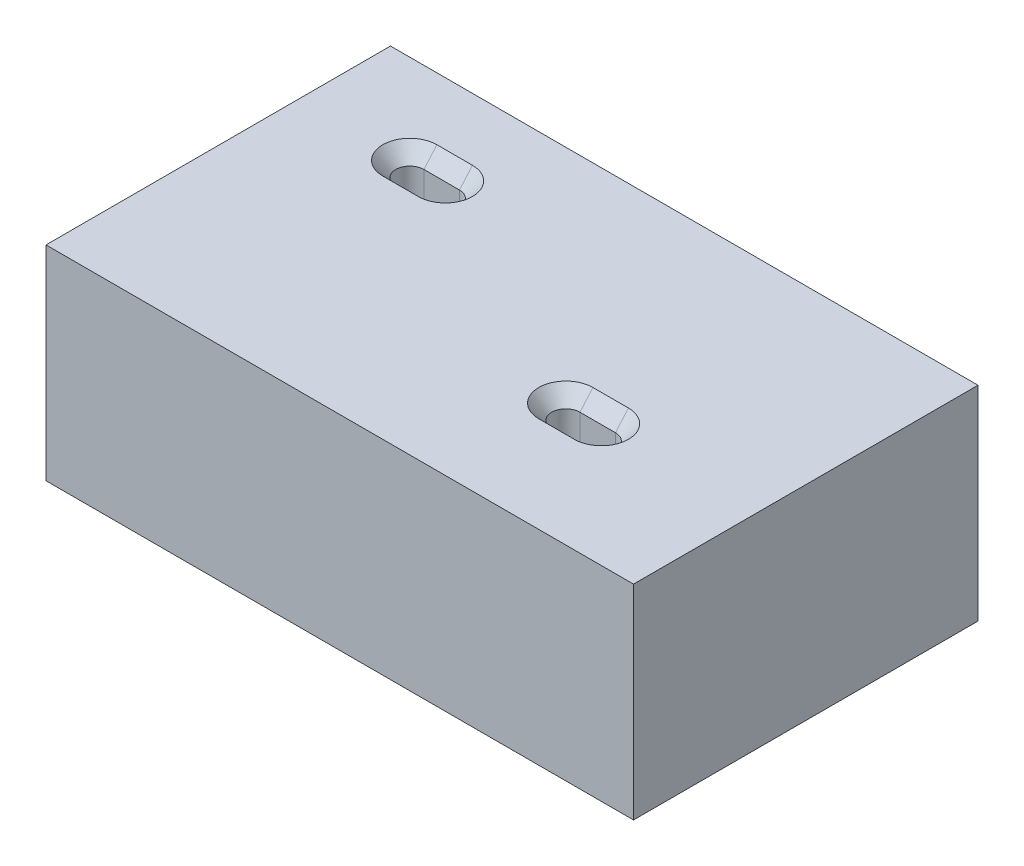
ISO-10303-21;
HEADER;
FILE_DESCRIPTION(('STEP AP214'),'2;1');
FILE_NAME('part.step','',(''),(''),'','','');
FILE_SCHEMA(('AUTOMOTIVE_DESIGN { 1 0 10303 214 1 1 1 1 }'));
ENDSEC;
DATA;
#1=APPLICATION_CONTEXT('core data for automotive mechanical design processes');
#2=APPLICATION_PROTOCOL_DEFINITION('international standard','automotive_design',2000,#1);
#3=PRODUCT_CONTEXT('',#1,'mechanical');
#4=PRODUCT('Part','Part','',(#3));
#5=PRODUCT_RELATED_PRODUCT_CATEGORY('part','',(#4));
#6=PRODUCT_DEFINITION_FORMATION('','',#4);
#7=PRODUCT_DEFINITION_CONTEXT('part definition',#1,'design');
#8=PRODUCT_DEFINITION('design','',#6,#7);
#9=PRODUCT_DEFINITION_SHAPE('','',#8);
#10=(LENGTH_UNIT() NAMED_UNIT(*) SI_UNIT(.MILLI.,.METRE.));
#11=(NAMED_UNIT(*) PLANE_ANGLE_UNIT() SI_UNIT($,.RADIAN.));
#12=(NAMED_UNIT(*) SI_UNIT($,.STERADIAN.) SOLID_ANGLE_UNIT());
#13=UNCERTAINTY_MEASURE_WITH_UNIT(LENGTH_MEASURE(1.E-05),#10,'distance_accuracy_value','');
#14=(GEOMETRIC_REPRESENTATION_CONTEXT(3) GLOBAL_UNCERTAINTY_ASSIGNED_CONTEXT((#13)) GLOBAL_UNIT_ASSIGNED_CONTEXT((#10,
#11,#12)) REPRESENTATION_CONTEXT('',''));
#15=CARTESIAN_POINT('',(0.,0.,0.));
#16=DIRECTION('',(0.,0.,1.));
#17=DIRECTION('',(1.,0.,0.));
#18=AXIS2_PLACEMENT_3D('',#15,#16,#17);
#19=CARTESIAN_POINT('',(0.,73.,0.));
#20=DIRECTION('',(0.,-1.,0.));
#21=DIRECTION('',(0.,0.,-1.));
#22=AXIS2_PLACEMENT_3D('',#19,#20,#21);
#23=PLANE('',#22);
#24=DIRECTION('',(1.,0.,0.));
#25=VECTOR('',#24,1.);
#26=CARTESIAN_POINT('',(36.8752456812785,73.,27.3159133510504));
#27=LINE('',#26,#25);
#28=CARTESIAN_POINT('',(36.8752456812785,73.,27.3159133510504));
#29=VERTEX_POINT('',#28);
#30=CARTESIAN_POINT('',(49.5752456812785,73.,27.3159133510504));
#31=VERTEX_POINT('',#30);
#32=EDGE_CURVE('E339',#29,#31,#27,.T.);
#33=ORIENTED_EDGE('',*,*,#32,.F.);
#34=CARTESIAN_POINT('',(36.8752456812785,73.,17.6385133510504));
#35=DIRECTION('',(0.,1.,0.));
#36=DIRECTION('',(0.,0.,1.));
#37=AXIS2_PLACEMENT_3D('',#34,#35,#36);
#38=CIRCLE('',#37,9.6774);
#39=CARTESIAN_POINT('',(36.8752456812785,73.,7.96111335105041));
#40=VERTEX_POINT('',#39);
#41=EDGE_CURVE('E356',#40,#29,#38,.T.);
#42=ORIENTED_EDGE('',*,*,#41,.F.);
#43=DIRECTION('',(1.,0.,0.));
#44=VECTOR('',#43,1.);
#45=CARTESIAN_POINT('',(36.8752456812785,73.,7.96111335105041));
#46=LINE('',#45,#44);
#47=CARTESIAN_POINT('',(49.5752456812785,73.,7.96111335105041));
#48=VERTEX_POINT('',#47);
#49=EDGE_CURVE('E348',#40,#48,#46,.T.);
#50=ORIENTED_EDGE('',*,*,#49,.T.);
#51=CARTESIAN_POINT('',(49.5752456812785,73.,17.6385133510504));
#52=DIRECTION('',(0.,1.,0.));
#53=DIRECTION('',(0.,0.,1.));
#54=AXIS2_PLACEMENT_3D('',#51,#52,#53);
#55=CIRCLE('',#54,9.6774);
#56=EDGE_CURVE('E372',#31,#48,#55,.T.);
#57=ORIENTED_EDGE('',*,*,#56,.F.);
#58=EDGE_LOOP('',(#33,#42,#50,#57));
#59=FACE_BOUND('',#58,.T.);
#60=DIRECTION('',(-1.,0.,0.));
#61=VECTOR('',#60,1.);
#62=CARTESIAN_POINT('',(104.976207719473,73.,-61.5512671348957));
#63=LINE('',#62,#61);
#64=CARTESIAN_POINT('',(104.976207719473,73.,-61.5512671348957));
#65=VERTEX_POINT('',#64);
#66=CARTESIAN_POINT('',(-104.976207719473,73.,-61.5512671348957));
#67=VERTEX_POINT('',#66);
#68=EDGE_CURVE('E384',#65,#67,#63,.T.);
#69=ORIENTED_EDGE('',*,*,#68,.T.);
#70=DIRECTION('',(0.,0.,-1.));
#71=VECTOR('',#70,1.);
#72=CARTESIAN_POINT('',(-104.976207719473,73.,61.5512671348957));
#73=LINE('',#72,#71);
#74=CARTESIAN_POINT('',(-104.976207719473,73.,61.5512671348957));
#75=VERTEX_POINT('',#74);
#76=EDGE_CURVE('E386',#75,#67,#73,.T.);
#77=ORIENTED_EDGE('',*,*,#76,.F.);
#78=DIRECTION('',(-1.,0.,0.));
#79=VECTOR('',#78,1.);
#80=CARTESIAN_POINT('',(104.976207719473,73.,61.5512671348957));
#81=LINE('',#80,#79);
#82=CARTESIAN_POINT('',(104.976207719473,73.,61.5512671348957));
#83=VERTEX_POINT('',#82);
#84=EDGE_CURVE('E390',#83,#75,#81,.T.);
#85=ORIENTED_EDGE('',*,*,#84,.F.);
#86=DIRECTION('',(0.,0.,-1.));
#87=VECTOR('',#86,1.);
#88=CARTESIAN_POINT('',(104.976207719473,73.,61.5512671348957));
#89=LINE('',#88,#87);
#90=EDGE_CURVE('E393',#83,#65,#89,.T.);
#91=ORIENTED_EDGE('',*,*,#90,.T.);
#92=EDGE_LOOP('',(#69,#77,#85,#91));
#93=FACE_BOUND('',#92,.T.);
#94=DIRECTION('',(1.,0.,0.));
#95=VECTOR('',#94,1.);
#96=CARTESIAN_POINT('',(-66.1249619118939,73.,-19.9378816758384));
#97=LINE('',#96,#95);
#98=CARTESIAN_POINT('',(-66.1249619118939,73.,-19.9378816758384));
#99=VERTEX_POINT('',#98);
#100=CARTESIAN_POINT('',(-53.4249619118939,73.,-19.9378816758384));
#101=VERTEX_POINT('',#100);
#102=EDGE_CURVE('E467',#99,#101,#97,.T.);
#103=ORIENTED_EDGE('',*,*,#102,.F.);
#104=CARTESIAN_POINT('',(-66.1249619118939,73.,-29.6152816758384));
#105=DIRECTION('',(0.,1.,0.));
#106=DIRECTION('',(0.,0.,1.));
#107=AXIS2_PLACEMENT_3D('',#104,#105,#106);
#108=CIRCLE('',#107,9.6774);
#109=CARTESIAN_POINT('',(-66.1249619118939,73.,-39.2926816758384));
#110=VERTEX_POINT('',#109);
#111=EDGE_CURVE('E311',#110,#99,#108,.T.);
#112=ORIENTED_EDGE('',*,*,#111,.F.);
#113=DIRECTION('',(1.,0.,0.));
#114=VECTOR('',#113,1.);
#115=CARTESIAN_POINT('',(-66.1249619118939,73.,-39.2926816758384));
#116=LINE('',#115,#114);
#117=CARTESIAN_POINT('',(-53.424961911894,73.,-39.2926816758384));
#118=VERTEX_POINT('',#117);
#119=EDGE_CURVE('E304',#110,#118,#116,.T.);
#120=ORIENTED_EDGE('',*,*,#119,.T.);
#121=CARTESIAN_POINT('',(-53.4249619118939,73.,-29.6152816758384));
#122=DIRECTION('',(0.,1.,0.));
#123=DIRECTION('',(0.,0.,1.));
#124=AXIS2_PLACEMENT_3D('',#121,#122,#123);
#125=CIRCLE('',#124,9.6774);
#126=EDGE_CURVE('E328',#101,#118,#125,.T.);
#127=ORIENTED_EDGE('',*,*,#126,.F.);
#128=EDGE_LOOP('',(#103,#112,#120,#127));
#129=FACE_BOUND('',#128,.T.);
#130=ADVANCED_FACE('F181',(#59,#93,#129),#23,.F.);
#131=CARTESIAN_POINT('',(104.976207719473,73.,-61.5512671348957));
#132=DIRECTION('',(0.,0.,1.));
#133=DIRECTION('',(1.,0.,0.));
#134=AXIS2_PLACEMENT_3D('',#131,#132,#133);
#135=PLANE('',#134);
#136=DIRECTION('',(-1.,0.,0.));
#137=VECTOR('',#136,1.);
#138=CARTESIAN_POINT('',(104.976207719473,0.,-61.5512671348957));
#139=LINE('',#138,#137);
#140=CARTESIAN_POINT('',(104.976207719473,0.,-61.5512671348957));
#141=VERTEX_POINT('',#140);
#142=CARTESIAN_POINT('',(-104.976207719473,0.,-61.5512671348957));
#143=VERTEX_POINT('',#142);
#144=EDGE_CURVE('E383',#141,#143,#139,.T.);
#145=ORIENTED_EDGE('',*,*,#144,.T.);
#146=DIRECTION('',(0.,-1.,0.));
#147=VECTOR('',#146,1.);
#148=CARTESIAN_POINT('',(-104.976207719473,73.,-61.5512671348957));
#149=LINE('',#148,#147);
#150=EDGE_CURVE('E411',#67,#143,#149,.T.);
#151=ORIENTED_EDGE('',*,*,#150,.F.);
#152=ORIENTED_EDGE('',*,*,#68,.F.);
#153=DIRECTION('',(0.,-1.,0.));
#154=VECTOR('',#153,1.);
#155=CARTESIAN_POINT('',(104.976207719473,73.,-61.5512671348957));
#156=LINE('',#155,#154);
#157=EDGE_CURVE('E395',#65,#141,#156,.T.);
#158=ORIENTED_EDGE('',*,*,#157,.T.);
#159=EDGE_LOOP('',(#145,#151,#152,#158));
#160=FACE_BOUND('',#159,.T.);
#161=ADVANCED_FACE('F183',(#160),#135,.F.);
#162=CARTESIAN_POINT('',(-104.976207719473,73.,61.5512671348957));
#163=DIRECTION('',(-1.,0.,0.));
#164=DIRECTION('',(0.,0.,1.));
#165=AXIS2_PLACEMENT_3D('',#162,#163,#164);
#166=PLANE('',#165);
#167=DIRECTION('',(0.,0.,-1.));
#168=VECTOR('',#167,1.);
#169=CARTESIAN_POINT('',(-104.976207719473,0.,61.5512671348957));
#170=LINE('',#169,#168);
#171=CARTESIAN_POINT('',(-104.976207719473,0.,61.5512671348957));
#172=VERTEX_POINT('',#171);
#173=EDGE_CURVE('E398',#172,#143,#170,.T.);
#174=ORIENTED_EDGE('',*,*,#173,.F.);
#175=DIRECTION('',(0.,-1.,0.));
#176=VECTOR('',#175,1.);
#177=CARTESIAN_POINT('',(-104.976207719473,73.,61.5512671348957));
#178=LINE('',#177,#176);
#179=EDGE_CURVE('E409',#75,#172,#178,.T.);
#180=ORIENTED_EDGE('',*,*,#179,.F.);
#181=ORIENTED_EDGE('',*,*,#76,.T.);
#182=ORIENTED_EDGE('',*,*,#150,.T.);
#183=EDGE_LOOP('',(#174,#180,#181,#182));
#184=FACE_BOUND('',#183,.T.);
#185=ADVANCED_FACE('F459',(#184),#166,.T.);
#186=CARTESIAN_POINT('',(104.976207719473,73.,61.5512671348957));
#187=DIRECTION('',(0.,0.,1.));
#188=DIRECTION('',(1.,0.,0.));
#189=AXIS2_PLACEMENT_3D('',#186,#187,#188);
#190=PLANE('',#189);
#191=DIRECTION('',(-1.,0.,0.));
#192=VECTOR('',#191,1.);
#193=CARTESIAN_POINT('',(104.976207719473,0.,61.5512671348957));
#194=LINE('',#193,#192);
#195=CARTESIAN_POINT('',(104.976207719473,0.,61.5512671348957));
#196=VERTEX_POINT('',#195);
#197=EDGE_CURVE('E401',#196,#172,#194,.T.);
#198=ORIENTED_EDGE('',*,*,#197,.F.);
#199=DIRECTION('',(0.,-1.,0.));
#200=VECTOR('',#199,1.);
#201=CARTESIAN_POINT('',(104.976207719473,73.,61.5512671348957));
#202=LINE('',#201,#200);
#203=EDGE_CURVE('E407',#83,#196,#202,.T.);
#204=ORIENTED_EDGE('',*,*,#203,.F.);
#205=ORIENTED_EDGE('',*,*,#84,.T.);
#206=ORIENTED_EDGE('',*,*,#179,.T.);
#207=EDGE_LOOP('',(#198,#204,#205,#206));
#208=FACE_BOUND('',#207,.T.);
#209=ADVANCED_FACE('F456',(#208),#190,.T.);
#210=CARTESIAN_POINT('',(104.976207719473,73.,61.5512671348957));
#211=DIRECTION('',(-1.,0.,0.));
#212=DIRECTION('',(0.,0.,1.));
#213=AXIS2_PLACEMENT_3D('',#210,#211,#212);
#214=PLANE('',#213);
#215=DIRECTION('',(0.,0.,-1.));
#216=VECTOR('',#215,1.);
#217=CARTESIAN_POINT('',(104.976207719473,0.,61.5512671348957));
#218=LINE('',#217,#216);
#219=EDGE_CURVE('E387',#196,#141,#218,.T.);
#220=ORIENTED_EDGE('',*,*,#219,.T.);
#221=ORIENTED_EDGE('',*,*,#157,.F.);
#222=ORIENTED_EDGE('',*,*,#90,.F.);
#223=ORIENTED_EDGE('',*,*,#203,.T.);
#224=EDGE_LOOP('',(#220,#221,#222,#223));
#225=FACE_BOUND('',#224,.T.);
#226=ADVANCED_FACE('F438',(#225),#214,.F.);
#227=CARTESIAN_POINT('',(0.,0.,0.));
#228=DIRECTION('',(0.,-1.,0.));
#229=DIRECTION('',(0.,0.,-1.));
#230=AXIS2_PLACEMENT_3D('',#227,#228,#229);
#231=PLANE('',#230);
#232=DIRECTION('',(1.,0.,0.));
#233=VECTOR('',#232,1.);
#234=CARTESIAN_POINT('',(0.,0.,-34.6571816758384));
#235=LINE('',#234,#233);
#236=CARTESIAN_POINT('',(-66.1249619118939,0.,-34.6571816758384));
#237=VERTEX_POINT('',#236);
#238=CARTESIAN_POINT('',(-53.4249619118939,0.,-34.6571816758384));
#239=VERTEX_POINT('',#238);
#240=EDGE_CURVE('E13',#237,#239,#235,.T.);
#241=ORIENTED_EDGE('',*,*,#240,.F.);
#242=CARTESIAN_POINT('',(-66.1249619118939,0.,-29.6152816758384));
#243=DIRECTION('',(0.,-1.,0.));
#244=DIRECTION('',(0.,0.,-1.));
#245=AXIS2_PLACEMENT_3D('',#242,#243,#244);
#246=CIRCLE('',#245,5.04189999999999);
#247=CARTESIAN_POINT('',(-66.1249619118939,0.,-24.5733816758384));
#248=VERTEX_POINT('',#247);
#249=EDGE_CURVE('E310',#248,#237,#246,.T.);
#250=ORIENTED_EDGE('',*,*,#249,.F.);
#251=DIRECTION('',(-1.,0.,0.));
#252=VECTOR('',#251,1.);
#253=CARTESIAN_POINT('',(0.,0.,-24.5733816758385));
#254=LINE('',#253,#252);
#255=CARTESIAN_POINT('',(-53.4249619118939,0.,-24.5733816758384));
#256=VERTEX_POINT('',#255);
#257=EDGE_CURVE('E422',#256,#248,#254,.T.);
#258=ORIENTED_EDGE('',*,*,#257,.F.);
#259=CARTESIAN_POINT('',(-53.4249619118939,0.,-29.6152816758384));
#260=DIRECTION('',(0.,-1.,0.));
#261=DIRECTION('',(0.,0.,-1.));
#262=AXIS2_PLACEMENT_3D('',#259,#260,#261);
#263=CIRCLE('',#262,5.04189999999999);
#264=EDGE_CURVE('E189',#239,#256,#263,.T.);
#265=ORIENTED_EDGE('',*,*,#264,.F.);
#266=EDGE_LOOP('',(#241,#250,#258,#265));
#267=FACE_BOUND('',#266,.T.);
#268=DIRECTION('',(1.,0.,0.));
#269=VECTOR('',#268,1.);
#270=CARTESIAN_POINT('',(0.,0.,12.5966133510504));
#271=LINE('',#270,#269);
#272=CARTESIAN_POINT('',(36.8752456812785,0.,12.5966133510504));
#273=VERTEX_POINT('',#272);
#274=CARTESIAN_POINT('',(49.5752456812785,0.,12.5966133510504));
#275=VERTEX_POINT('',#274);
#276=EDGE_CURVE('E419',#273,#275,#271,.T.);
#277=ORIENTED_EDGE('',*,*,#276,.F.);
#278=CARTESIAN_POINT('',(36.8752456812785,0.,17.6385133510504));
#279=DIRECTION('',(0.,-1.,0.));
#280=DIRECTION('',(0.,0.,-1.));
#281=AXIS2_PLACEMENT_3D('',#278,#279,#280);
#282=CIRCLE('',#281,5.04189999999999);
#283=CARTESIAN_POINT('',(36.8752456812785,0.,22.6804133510504));
#284=VERTEX_POINT('',#283);
#285=EDGE_CURVE('E415',#284,#273,#282,.T.);
#286=ORIENTED_EDGE('',*,*,#285,.F.);
#287=DIRECTION('',(-1.,0.,0.));
#288=VECTOR('',#287,1.);
#289=CARTESIAN_POINT('',(0.,0.,22.6804133510504));
#290=LINE('',#289,#288);
#291=CARTESIAN_POINT('',(49.5752456812785,0.,22.6804133510504));
#292=VERTEX_POINT('',#291);
#293=EDGE_CURVE('E413',#292,#284,#290,.T.);
#294=ORIENTED_EDGE('',*,*,#293,.F.);
#295=CARTESIAN_POINT('',(49.5752456812785,0.,17.6385133510504));
#296=DIRECTION('',(0.,-1.,0.));
#297=DIRECTION('',(0.,0.,-1.));
#298=AXIS2_PLACEMENT_3D('',#295,#296,#297);
#299=CIRCLE('',#298,5.04189999999999);
#300=EDGE_CURVE('E417',#275,#292,#299,.T.);
#301=ORIENTED_EDGE('',*,*,#300,.F.);
#302=EDGE_LOOP('',(#277,#286,#294,#301));
#303=FACE_BOUND('',#302,.T.);
#304=ORIENTED_EDGE('',*,*,#144,.F.);
#305=ORIENTED_EDGE('',*,*,#219,.F.);
#306=ORIENTED_EDGE('',*,*,#197,.T.);
#307=ORIENTED_EDGE('',*,*,#173,.T.);
#308=EDGE_LOOP('',(#304,#305,#306,#307));
#309=FACE_BOUND('',#308,.T.);
#310=ADVANCED_FACE('F434',(#267,#303,#309),#231,.T.);
#311=CARTESIAN_POINT('',(49.5752456812785,73.,17.6385133510504));
#312=DIRECTION('',(0.,1.,0.));
#313=DIRECTION('',(0.,0.,1.));
#314=AXIS2_PLACEMENT_3D('',#311,#312,#313);
#315=CYLINDRICAL_SURFACE('',#314,5.04189999999999);
#316=ORIENTED_EDGE('',*,*,#300,.T.);
#317=DIRECTION('',(0.,1.,0.));
#318=VECTOR('',#317,1.);
#319=CARTESIAN_POINT('',(49.5752456812785,73.,22.6804133510504));
#320=LINE('',#319,#318);
#321=CARTESIAN_POINT('',(49.5752456812785,67.667467248327,22.6804133510504));
#322=VERTEX_POINT('',#321);
#323=EDGE_CURVE('E369',#322,#292,#320,.F.);
#324=ORIENTED_EDGE('',*,*,#323,.F.);
#325=CARTESIAN_POINT('',(49.5752456812785,67.667467248327,17.6385133510504));
#326=DIRECTION('',(0.,1.,0.));
#327=DIRECTION('',(0.,0.,1.));
#328=AXIS2_PLACEMENT_3D('',#325,#326,#327);
#329=CIRCLE('',#328,5.04189999999999);
#330=CARTESIAN_POINT('',(49.5752456812785,67.667467248327,12.5966133510504));
#331=VERTEX_POINT('',#330);
#332=EDGE_CURVE('E375',#322,#331,#329,.T.);
#333=ORIENTED_EDGE('',*,*,#332,.T.);
#334=DIRECTION('',(0.,1.,0.));
#335=VECTOR('',#334,1.);
#336=CARTESIAN_POINT('',(49.5752456812785,73.,12.5966133510504));
#337=LINE('',#336,#335);
#338=EDGE_CURVE('E367',#275,#331,#337,.T.);
#339=ORIENTED_EDGE('',*,*,#338,.F.);
#340=EDGE_LOOP('',(#316,#324,#333,#339));
#341=FACE_BOUND('',#340,.T.);
#342=ADVANCED_FACE('F437',(#341),#315,.F.);
#343=CARTESIAN_POINT('',(36.8752456812785,73.,17.6385133510504));
#344=DIRECTION('',(0.,1.,0.));
#345=DIRECTION('',(0.,0.,1.));
#346=AXIS2_PLACEMENT_3D('',#343,#344,#345);
#347=CYLINDRICAL_SURFACE('',#346,5.04189999999999);
#348=ORIENTED_EDGE('',*,*,#285,.T.);
#349=DIRECTION('',(0.,1.,0.));
#350=VECTOR('',#349,1.);
#351=CARTESIAN_POINT('',(36.8752456812785,73.,12.5966133510504));
#352=LINE('',#351,#350);
#353=CARTESIAN_POINT('',(36.8752456812785,67.667467248327,12.5966133510504));
#354=VERTEX_POINT('',#353);
#355=EDGE_CURVE('E353',#354,#273,#352,.F.);
#356=ORIENTED_EDGE('',*,*,#355,.F.);
#357=CARTESIAN_POINT('',(36.8752456812785,67.667467248327,17.6385133510504));
#358=DIRECTION('',(0.,1.,0.));
#359=DIRECTION('',(0.,0.,1.));
#360=AXIS2_PLACEMENT_3D('',#357,#358,#359);
#361=CIRCLE('',#360,5.04189999999999);
#362=CARTESIAN_POINT('',(36.8752456812785,67.667467248327,22.6804133510504));
#363=VERTEX_POINT('',#362);
#364=EDGE_CURVE('E359',#354,#363,#361,.T.);
#365=ORIENTED_EDGE('',*,*,#364,.T.);
#366=DIRECTION('',(0.,1.,0.));
#367=VECTOR('',#366,1.);
#368=CARTESIAN_POINT('',(36.8752456812785,73.,22.6804133510504));
#369=LINE('',#368,#367);
#370=EDGE_CURVE('E351',#284,#363,#369,.T.);
#371=ORIENTED_EDGE('',*,*,#370,.F.);
#372=EDGE_LOOP('',(#348,#356,#365,#371));
#373=FACE_BOUND('',#372,.T.);
#374=ADVANCED_FACE('F502',(#373),#347,.F.);
#375=CARTESIAN_POINT('',(36.8752456812785,73.,12.5966133510504));
#376=DIRECTION('',(0.,0.,-1.));
#377=DIRECTION('',(-1.,0.,0.));
#378=AXIS2_PLACEMENT_3D('',#375,#376,#377);
#379=PLANE('',#378);
#380=ORIENTED_EDGE('',*,*,#276,.T.);
#381=ORIENTED_EDGE('',*,*,#338,.T.);
#382=DIRECTION('',(1.,0.,0.));
#383=VECTOR('',#382,1.);
#384=CARTESIAN_POINT('',(36.8752456812785,67.667467248327,12.5966133510504));
#385=LINE('',#384,#383);
#386=EDGE_CURVE('E345',#354,#331,#385,.T.);
#387=ORIENTED_EDGE('',*,*,#386,.F.);
#388=ORIENTED_EDGE('',*,*,#355,.T.);
#389=EDGE_LOOP('',(#380,#381,#387,#388));
#390=FACE_BOUND('',#389,.T.);
#391=ADVANCED_FACE('F498',(#390),#379,.F.);
#392=CARTESIAN_POINT('',(36.8752456812785,73.,22.6804133510504));
#393=DIRECTION('',(0.,0.,1.));
#394=DIRECTION('',(1.,0.,0.));
#395=AXIS2_PLACEMENT_3D('',#392,#393,#394);
#396=PLANE('',#395);
#397=ORIENTED_EDGE('',*,*,#293,.T.);
#398=ORIENTED_EDGE('',*,*,#370,.T.);
#399=DIRECTION('',(1.,0.,0.));
#400=VECTOR('',#399,1.);
#401=CARTESIAN_POINT('',(36.8752456812785,67.667467248327,22.6804133510504));
#402=LINE('',#401,#400);
#403=EDGE_CURVE('E342',#363,#322,#402,.T.);
#404=ORIENTED_EDGE('',*,*,#403,.T.);
#405=ORIENTED_EDGE('',*,*,#323,.T.);
#406=EDGE_LOOP('',(#397,#398,#404,#405));
#407=FACE_BOUND('',#406,.T.);
#408=ADVANCED_FACE('F494',(#407),#396,.F.);
#409=CARTESIAN_POINT('',(49.5752456812785,73.,17.6385133510504));
#410=DIRECTION('',(0.,1.,0.));
#411=DIRECTION('',(0.,0.,1.));
#412=AXIS2_PLACEMENT_3D('',#409,#410,#411);
#413=CONICAL_SURFACE('',#412,9.6774,0.715584993317676);
#414=ORIENTED_EDGE('',*,*,#332,.F.);
#415=DIRECTION('',(0.,0.754709580222771,0.656059028990508));
#416=VECTOR('',#415,1.);
#417=CARTESIAN_POINT('',(49.5752456812785,61.8674247759594,17.6385133510504));
#418=LINE('',#417,#416);
#419=EDGE_CURVE('E380',#31,#322,#418,.F.);
#420=ORIENTED_EDGE('',*,*,#419,.F.);
#421=ORIENTED_EDGE('',*,*,#56,.T.);
#422=DIRECTION('',(0.,-0.754709580222771,0.656059028990508));
#423=VECTOR('',#422,1.);
#424=CARTESIAN_POINT('',(49.5752456812785,61.8674247759594,17.6385133510504));
#425=LINE('',#424,#423);
#426=EDGE_CURVE('E378',#331,#48,#425,.F.);
#427=ORIENTED_EDGE('',*,*,#426,.F.);
#428=EDGE_LOOP('',(#414,#420,#421,#427));
#429=FACE_BOUND('',#428,.T.);
#430=ADVANCED_FACE('F497',(#429),#413,.F.);
#431=CARTESIAN_POINT('',(36.8752456812785,73.,17.6385133510504));
#432=DIRECTION('',(0.,1.,0.));
#433=DIRECTION('',(0.,0.,1.));
#434=AXIS2_PLACEMENT_3D('',#431,#432,#433);
#435=CONICAL_SURFACE('',#434,9.6774,0.715584993317676);
#436=ORIENTED_EDGE('',*,*,#41,.T.);
#437=DIRECTION('',(0.,-0.754709580222771,-0.656059028990508));
#438=VECTOR('',#437,1.);
#439=CARTESIAN_POINT('',(36.8752456812785,61.8674247759594,17.6385133510504));
#440=LINE('',#439,#438);
#441=EDGE_CURVE('E362',#363,#29,#440,.F.);
#442=ORIENTED_EDGE('',*,*,#441,.F.);
#443=ORIENTED_EDGE('',*,*,#364,.F.);
#444=DIRECTION('',(0.,0.754709580222771,-0.656059028990508));
#445=VECTOR('',#444,1.);
#446=CARTESIAN_POINT('',(36.8752456812785,61.8674247759594,17.6385133510504));
#447=LINE('',#446,#445);
#448=EDGE_CURVE('E364',#40,#354,#447,.F.);
#449=ORIENTED_EDGE('',*,*,#448,.F.);
#450=EDGE_LOOP('',(#436,#442,#443,#449));
#451=FACE_BOUND('',#450,.T.);
#452=ADVANCED_FACE('F506',(#451),#435,.F.);
#453=CARTESIAN_POINT('',(36.8752456812785,61.8674247759594,17.6385133510504));
#454=DIRECTION('',(0.,-0.656059028990508,-0.754709580222771));
#455=DIRECTION('',(0.,0.754709580222771,-0.656059028990508));
#456=AXIS2_PLACEMENT_3D('',#453,#454,#455);
#457=PLANE('',#456);
#458=ORIENTED_EDGE('',*,*,#426,.T.);
#459=ORIENTED_EDGE('',*,*,#49,.F.);
#460=ORIENTED_EDGE('',*,*,#448,.T.);
#461=ORIENTED_EDGE('',*,*,#386,.T.);
#462=EDGE_LOOP('',(#458,#459,#460,#461));
#463=FACE_BOUND('',#462,.T.);
#464=ADVANCED_FACE('F492',(#463),#457,.F.);
#465=CARTESIAN_POINT('',(36.8752456812785,61.8674247759594,17.6385133510504));
#466=DIRECTION('',(0.,-0.656059028990508,0.754709580222771));
#467=DIRECTION('',(0.,-0.754709580222771,-0.656059028990508));
#468=AXIS2_PLACEMENT_3D('',#465,#466,#467);
#469=PLANE('',#468);
#470=ORIENTED_EDGE('',*,*,#419,.T.);
#471=ORIENTED_EDGE('',*,*,#403,.F.);
#472=ORIENTED_EDGE('',*,*,#441,.T.);
#473=ORIENTED_EDGE('',*,*,#32,.T.);
#474=EDGE_LOOP('',(#470,#471,#472,#473));
#475=FACE_BOUND('',#474,.T.);
#476=ADVANCED_FACE('F489',(#475),#469,.F.);
#477=CARTESIAN_POINT('',(-53.4249619118939,73.,-29.6152816758384));
#478=DIRECTION('',(0.,1.,0.));
#479=DIRECTION('',(0.,0.,1.));
#480=AXIS2_PLACEMENT_3D('',#477,#478,#479);
#481=CYLINDRICAL_SURFACE('',#480,5.04189999999999);
#482=ORIENTED_EDGE('',*,*,#264,.T.);
#483=DIRECTION('',(0.,1.,0.));
#484=VECTOR('',#483,1.);
#485=CARTESIAN_POINT('',(-53.4249619118939,73.,-24.5733816758384));
#486=LINE('',#485,#484);
#487=CARTESIAN_POINT('',(-53.4249619118939,67.667467248327,-24.5733816758384));
#488=VERTEX_POINT('',#487);
#489=EDGE_CURVE('E325',#488,#256,#486,.F.);
#490=ORIENTED_EDGE('',*,*,#489,.F.);
#491=CARTESIAN_POINT('',(-53.4249619118939,67.667467248327,-29.6152816758384));
#492=DIRECTION('',(0.,1.,0.));
#493=DIRECTION('',(0.,0.,1.));
#494=AXIS2_PLACEMENT_3D('',#491,#492,#493);
#495=CIRCLE('',#494,5.04189999999999);
#496=CARTESIAN_POINT('',(-53.4249619118939,67.667467248327,-34.6571816758384));
#497=VERTEX_POINT('',#496);
#498=EDGE_CURVE('E331',#488,#497,#495,.T.);
#499=ORIENTED_EDGE('',*,*,#498,.T.);
#500=DIRECTION('',(0.,1.,0.));
#501=VECTOR('',#500,1.);
#502=CARTESIAN_POINT('',(-53.4249619118939,73.,-34.6571816758384));
#503=LINE('',#502,#501);
#504=EDGE_CURVE('E301',#239,#497,#503,.T.);
#505=ORIENTED_EDGE('',*,*,#504,.F.);
#506=EDGE_LOOP('',(#482,#490,#499,#505));
#507=FACE_BOUND('',#506,.T.);
#508=ADVANCED_FACE('F427',(#507),#481,.F.);
#509=CARTESIAN_POINT('',(-66.1249619118939,73.,-29.6152816758384));
#510=DIRECTION('',(0.,1.,0.));
#511=DIRECTION('',(0.,0.,1.));
#512=AXIS2_PLACEMENT_3D('',#509,#510,#511);
#513=CYLINDRICAL_SURFACE('',#512,5.04189999999999);
#514=ORIENTED_EDGE('',*,*,#249,.T.);
#515=DIRECTION('',(0.,1.,0.));
#516=VECTOR('',#515,1.);
#517=CARTESIAN_POINT('',(-66.1249619118939,73.,-34.6571816758384));
#518=LINE('',#517,#516);
#519=CARTESIAN_POINT('',(-66.1249619118939,67.667467248327,-34.6571816758384));
#520=VERTEX_POINT('',#519);
#521=EDGE_CURVE('E298',#520,#237,#518,.F.);
#522=ORIENTED_EDGE('',*,*,#521,.F.);
#523=CARTESIAN_POINT('',(-66.1249619118939,67.667467248327,-29.6152816758384));
#524=DIRECTION('',(0.,1.,0.));
#525=DIRECTION('',(0.,0.,1.));
#526=AXIS2_PLACEMENT_3D('',#523,#524,#525);
#527=CIRCLE('',#526,5.04189999999999);
#528=CARTESIAN_POINT('',(-66.1249619118939,67.667467248327,-24.5733816758384));
#529=VERTEX_POINT('',#528);
#530=EDGE_CURVE('E308',#520,#529,#527,.T.);
#531=ORIENTED_EDGE('',*,*,#530,.T.);
#532=DIRECTION('',(0.,1.,0.));
#533=VECTOR('',#532,1.);
#534=CARTESIAN_POINT('',(-66.1249619118939,73.,-24.5733816758384));
#535=LINE('',#534,#533);
#536=EDGE_CURVE('E204',#248,#529,#535,.T.);
#537=ORIENTED_EDGE('',*,*,#536,.F.);
#538=EDGE_LOOP('',(#514,#522,#531,#537));
#539=FACE_BOUND('',#538,.T.);
#540=ADVANCED_FACE('F307',(#539),#513,.F.);
#541=CARTESIAN_POINT('',(-66.1249619118939,73.,-34.6571816758384));
#542=DIRECTION('',(0.,0.,-1.));
#543=DIRECTION('',(-1.,0.,0.));
#544=AXIS2_PLACEMENT_3D('',#541,#542,#543);
#545=PLANE('',#544);
#546=ORIENTED_EDGE('',*,*,#240,.T.);
#547=ORIENTED_EDGE('',*,*,#504,.T.);
#548=DIRECTION('',(1.,0.,0.));
#549=VECTOR('',#548,1.);
#550=CARTESIAN_POINT('',(-66.1249619118939,67.667467248327,-34.6571816758384));
#551=LINE('',#550,#549);
#552=EDGE_CURVE('E295',#520,#497,#551,.T.);
#553=ORIENTED_EDGE('',*,*,#552,.F.);
#554=ORIENTED_EDGE('',*,*,#521,.T.);
#555=EDGE_LOOP('',(#546,#547,#553,#554));
#556=FACE_BOUND('',#555,.T.);
#557=ADVANCED_FACE('F297',(#556),#545,.F.);
#558=CARTESIAN_POINT('',(-66.1249619118939,73.,-24.5733816758384));
#559=DIRECTION('',(0.,0.,1.));
#560=DIRECTION('',(1.,0.,0.));
#561=AXIS2_PLACEMENT_3D('',#558,#559,#560);
#562=PLANE('',#561);
#563=ORIENTED_EDGE('',*,*,#257,.T.);
#564=ORIENTED_EDGE('',*,*,#536,.T.);
#565=DIRECTION('',(1.,0.,0.));
#566=VECTOR('',#565,1.);
#567=CARTESIAN_POINT('',(-66.1249619118939,67.667467248327,-24.5733816758384));
#568=LINE('',#567,#566);
#569=EDGE_CURVE('E305',#529,#488,#568,.T.);
#570=ORIENTED_EDGE('',*,*,#569,.T.);
#571=ORIENTED_EDGE('',*,*,#489,.T.);
#572=EDGE_LOOP('',(#563,#564,#570,#571));
#573=FACE_BOUND('',#572,.T.);
#574=ADVANCED_FACE('F432',(#573),#562,.F.);
#575=CARTESIAN_POINT('',(-53.4249619118939,73.,-29.6152816758384));
#576=DIRECTION('',(0.,1.,0.));
#577=DIRECTION('',(0.,0.,1.));
#578=AXIS2_PLACEMENT_3D('',#575,#576,#577);
#579=CONICAL_SURFACE('',#578,9.6774,0.715584993317676);
#580=ORIENTED_EDGE('',*,*,#498,.F.);
#581=DIRECTION('',(0.,0.754709580222771,0.656059028990508));
#582=VECTOR('',#581,1.);
#583=CARTESIAN_POINT('',(-53.4249619118939,61.8674247759594,-29.6152816758384));
#584=LINE('',#583,#582);
#585=EDGE_CURVE('E336',#101,#488,#584,.F.);
#586=ORIENTED_EDGE('',*,*,#585,.F.);
#587=ORIENTED_EDGE('',*,*,#126,.T.);
#588=DIRECTION('',(0.,-0.754709580222771,0.656059028990508));
#589=VECTOR('',#588,1.);
#590=CARTESIAN_POINT('',(-53.4249619118939,61.8674247759594,-29.6152816758384));
#591=LINE('',#590,#589);
#592=EDGE_CURVE('E334',#497,#118,#591,.F.);
#593=ORIENTED_EDGE('',*,*,#592,.F.);
#594=EDGE_LOOP('',(#580,#586,#587,#593));
#595=FACE_BOUND('',#594,.T.);
#596=ADVANCED_FACE('F476',(#595),#579,.F.);
#597=CARTESIAN_POINT('',(-66.1249619118939,73.,-29.6152816758384));
#598=DIRECTION('',(0.,1.,0.));
#599=DIRECTION('',(0.,0.,1.));
#600=AXIS2_PLACEMENT_3D('',#597,#598,#599);
#601=CONICAL_SURFACE('',#600,9.6774,0.715584993317676);
#602=ORIENTED_EDGE('',*,*,#111,.T.);
#603=DIRECTION('',(0.,-0.754709580222771,-0.656059028990508));
#604=VECTOR('',#603,1.);
#605=CARTESIAN_POINT('',(-66.1249619118939,61.8674247759594,-29.6152816758384));
#606=LINE('',#605,#604);
#607=EDGE_CURVE('E316',#529,#99,#606,.F.);
#608=ORIENTED_EDGE('',*,*,#607,.F.);
#609=ORIENTED_EDGE('',*,*,#530,.F.);
#610=DIRECTION('',(0.,0.754709580222771,-0.656059028990508));
#611=VECTOR('',#610,1.);
#612=CARTESIAN_POINT('',(-66.1249619118939,61.8674247759594,-29.6152816758384));
#613=LINE('',#612,#611);
#614=EDGE_CURVE('E196',#110,#520,#613,.F.);
#615=ORIENTED_EDGE('',*,*,#614,.F.);
#616=EDGE_LOOP('',(#602,#608,#609,#615));
#617=FACE_BOUND('',#616,.T.);
#618=ADVANCED_FACE('F319',(#617),#601,.F.);
#619=CARTESIAN_POINT('',(-66.1249619118939,61.8674247759594,-29.6152816758384));
#620=DIRECTION('',(0.,-0.656059028990508,-0.754709580222771));
#621=DIRECTION('',(0.,0.754709580222771,-0.656059028990508));
#622=AXIS2_PLACEMENT_3D('',#619,#620,#621);
#623=PLANE('',#622);
#624=ORIENTED_EDGE('',*,*,#592,.T.);
#625=ORIENTED_EDGE('',*,*,#119,.F.);
#626=ORIENTED_EDGE('',*,*,#614,.T.);
#627=ORIENTED_EDGE('',*,*,#552,.T.);
#628=EDGE_LOOP('',(#624,#625,#626,#627));
#629=FACE_BOUND('',#628,.T.);
#630=ADVANCED_FACE('F313',(#629),#623,.F.);
#631=CARTESIAN_POINT('',(-66.1249619118939,61.8674247759594,-29.6152816758384));
#632=DIRECTION('',(0.,-0.656059028990508,0.754709580222771));
#633=DIRECTION('',(0.,-0.754709580222771,-0.656059028990508));
#634=AXIS2_PLACEMENT_3D('',#631,#632,#633);
#635=PLANE('',#634);
#636=ORIENTED_EDGE('',*,*,#585,.T.);
#637=ORIENTED_EDGE('',*,*,#569,.F.);
#638=ORIENTED_EDGE('',*,*,#607,.T.);
#639=ORIENTED_EDGE('',*,*,#102,.T.);
#640=EDGE_LOOP('',(#636,#637,#638,#639));
#641=FACE_BOUND('',#640,.T.);
#642=ADVANCED_FACE('F474',(#641),#635,.F.);
#643=CLOSED_SHELL('',(#130,#161,#185,#209,#226,#310,#342,#374,#391,#408,#430,#452,#464,#476,
#508,#540,#557,#574,#596,#618,#630,#642));
#644=MANIFOLD_SOLID_BREP('B2',#643);
#645=ADVANCED_BREP_SHAPE_REPRESENTATION('',(#18,#644),#14);
#646=SHAPE_DEFINITION_REPRESENTATION(#9,#645);
ENDSEC;
END-ISO-10303-21;
